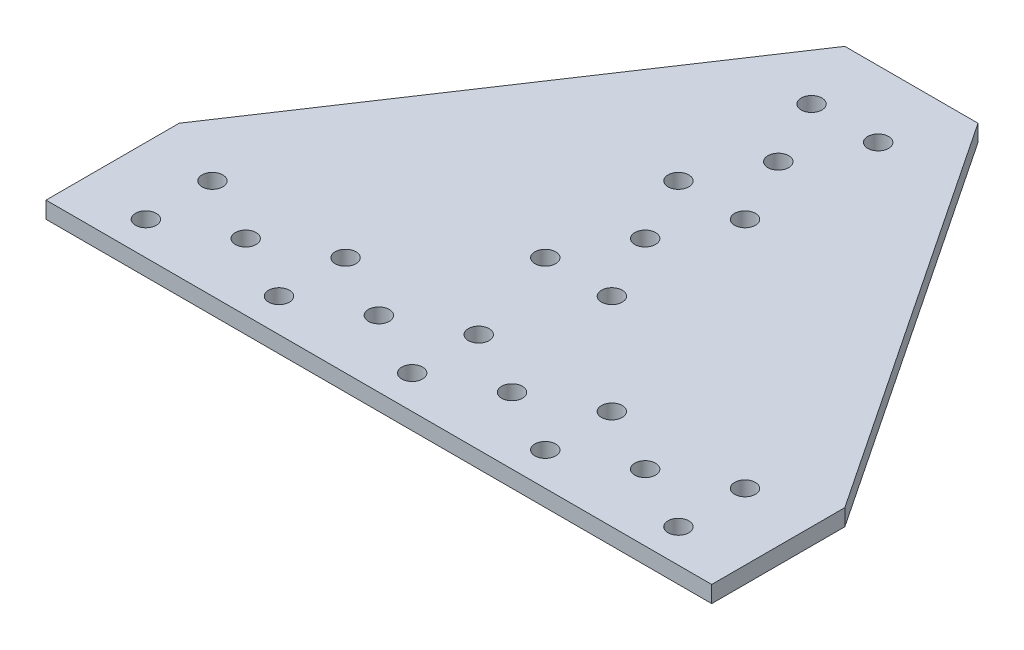
ISO-10303-21;
HEADER;
FILE_DESCRIPTION(('STEP AP214'),'2;1');
FILE_NAME('part.step','',(''),(''),'','','');
FILE_SCHEMA(('AUTOMOTIVE_DESIGN { 1 0 10303 214 1 1 1 1 }'));
ENDSEC;
DATA;
#1=APPLICATION_CONTEXT('core data for automotive mechanical design processes');
#2=APPLICATION_PROTOCOL_DEFINITION('international standard','automotive_design',2000,#1);
#3=PRODUCT_CONTEXT('',#1,'mechanical');
#4=PRODUCT('Part','Part','',(#3));
#5=PRODUCT_RELATED_PRODUCT_CATEGORY('part','',(#4));
#6=PRODUCT_DEFINITION_FORMATION('','',#4);
#7=PRODUCT_DEFINITION_CONTEXT('part definition',#1,'design');
#8=PRODUCT_DEFINITION('design','',#6,#7);
#9=PRODUCT_DEFINITION_SHAPE('','',#8);
#10=(LENGTH_UNIT() NAMED_UNIT(*) SI_UNIT(.MILLI.,.METRE.));
#11=(NAMED_UNIT(*) PLANE_ANGLE_UNIT() SI_UNIT($,.RADIAN.));
#12=(NAMED_UNIT(*) SI_UNIT($,.STERADIAN.) SOLID_ANGLE_UNIT());
#13=UNCERTAINTY_MEASURE_WITH_UNIT(LENGTH_MEASURE(1.E-05),#10,'distance_accuracy_value','');
#14=(GEOMETRIC_REPRESENTATION_CONTEXT(3) GLOBAL_UNCERTAINTY_ASSIGNED_CONTEXT((#13)) GLOBAL_UNIT_ASSIGNED_CONTEXT((#10,
#11,#12)) REPRESENTATION_CONTEXT('',''));
#15=CARTESIAN_POINT('',(0.,0.,0.));
#16=DIRECTION('',(0.,0.,1.));
#17=DIRECTION('',(1.,0.,0.));
#18=AXIS2_PLACEMENT_3D('',#15,#16,#17);
#19=CARTESIAN_POINT('',(0.,3.175,0.));
#20=DIRECTION('',(0.,1.,0.));
#21=DIRECTION('',(0.,0.,1.));
#22=AXIS2_PLACEMENT_3D('',#19,#20,#21);
#23=PLANE('',#22);
#24=CARTESIAN_POINT('',(-6.34999999999999,3.175,-63.5));
#25=DIRECTION('',(0.,1.,0.));
#26=DIRECTION('',(0.,0.,-1.));
#27=AXIS2_PLACEMENT_3D('',#24,#25,#26);
#28=CIRCLE('',#27,1.98437500000002);
#29=CARTESIAN_POINT('',(-6.34999999999999,3.175,-65.484375));
#30=VERTEX_POINT('',#29);
#31=EDGE_CURVE('E261',#30,#30,#28,.T.);
#32=ORIENTED_EDGE('',*,*,#31,.F.);
#33=EDGE_LOOP('',(#32));
#34=FACE_BOUND('',#33,.T.);
#35=CARTESIAN_POINT('',(-12.7000000000001,3.175,-12.7000000000001));
#36=DIRECTION('',(0.,1.,0.));
#37=DIRECTION('',(0.,0.,-1.));
#38=AXIS2_PLACEMENT_3D('',#35,#36,#37);
#39=CIRCLE('',#38,1.98437499999999);
#40=CARTESIAN_POINT('',(-12.7000000000001,3.175,-14.6843750000001));
#41=VERTEX_POINT('',#40);
#42=EDGE_CURVE('E273',#41,#41,#39,.T.);
#43=ORIENTED_EDGE('',*,*,#42,.F.);
#44=EDGE_LOOP('',(#43));
#45=FACE_BOUND('',#44,.T.);
#46=CARTESIAN_POINT('',(-25.4000000000001,3.175,-19.0500000000001));
#47=DIRECTION('',(0.,1.,0.));
#48=DIRECTION('',(0.,0.,-1.));
#49=AXIS2_PLACEMENT_3D('',#46,#47,#48);
#50=CIRCLE('',#49,1.984375);
#51=CARTESIAN_POINT('',(-25.4000000000001,3.175,-21.0343750000001));
#52=VERTEX_POINT('',#51);
#53=EDGE_CURVE('E285',#52,#52,#50,.T.);
#54=ORIENTED_EDGE('',*,*,#53,.F.);
#55=EDGE_LOOP('',(#54));
#56=FACE_BOUND('',#55,.T.);
#57=CARTESIAN_POINT('',(0.,3.175,-6.34999999999997));
#58=DIRECTION('',(0.,1.,0.));
#59=DIRECTION('',(0.,0.,-1.));
#60=AXIS2_PLACEMENT_3D('',#57,#58,#59);
#61=CIRCLE('',#60,1.98437500000004);
#62=CARTESIAN_POINT('',(0.,3.175,-8.334375));
#63=VERTEX_POINT('',#62);
#64=EDGE_CURVE('E297',#63,#63,#61,.T.);
#65=ORIENTED_EDGE('',*,*,#64,.F.);
#66=EDGE_LOOP('',(#65));
#67=FACE_BOUND('',#66,.T.);
#68=CARTESIAN_POINT('',(-50.8000000000001,3.175,-6.35000000000005));
#69=DIRECTION('',(0.,1.,0.));
#70=DIRECTION('',(0.,0.,-1.));
#71=AXIS2_PLACEMENT_3D('',#68,#69,#70);
#72=CIRCLE('',#71,1.98437499999995);
#73=CARTESIAN_POINT('',(-50.8000000000001,3.175,-8.334375));
#74=VERTEX_POINT('',#73);
#75=EDGE_CURVE('E309',#74,#74,#72,.T.);
#76=ORIENTED_EDGE('',*,*,#75,.F.);
#77=EDGE_LOOP('',(#76));
#78=FACE_BOUND('',#77,.T.);
#79=CARTESIAN_POINT('',(0.,3.175,-76.2));
#80=DIRECTION('',(0.,1.,0.));
#81=DIRECTION('',(0.,0.,-1.));
#82=AXIS2_PLACEMENT_3D('',#79,#80,#81);
#83=CIRCLE('',#82,1.98437500000004);
#84=CARTESIAN_POINT('',(0.,3.175,-78.1843750000001));
#85=VERTEX_POINT('',#84);
#86=EDGE_CURVE('E321',#85,#85,#83,.T.);
#87=ORIENTED_EDGE('',*,*,#86,.F.);
#88=EDGE_LOOP('',(#87));
#89=FACE_BOUND('',#88,.T.);
#90=CARTESIAN_POINT('',(50.8000000000001,3.175,-19.05));
#91=DIRECTION('',(0.,1.,0.));
#92=DIRECTION('',(0.,0.,1.));
#93=AXIS2_PLACEMENT_3D('',#90,#91,#92);
#94=CIRCLE('',#93,1.98437499999996);
#95=CARTESIAN_POINT('',(50.8000000000001,3.175,-17.065625));
#96=VERTEX_POINT('',#95);
#97=EDGE_CURVE('E333',#96,#96,#94,.T.);
#98=ORIENTED_EDGE('',*,*,#97,.F.);
#99=EDGE_LOOP('',(#98));
#100=FACE_BOUND('',#99,.T.);
#101=CARTESIAN_POINT('',(38.1000000000001,3.175,-12.7));
#102=DIRECTION('',(0.,1.,0.));
#103=DIRECTION('',(0.,0.,1.));
#104=AXIS2_PLACEMENT_3D('',#101,#102,#103);
#105=CIRCLE('',#104,1.984375);
#106=CARTESIAN_POINT('',(38.1000000000001,3.175,-10.715625));
#107=VERTEX_POINT('',#106);
#108=EDGE_CURVE('E345',#107,#107,#105,.T.);
#109=ORIENTED_EDGE('',*,*,#108,.F.);
#110=EDGE_LOOP('',(#109));
#111=FACE_BOUND('',#110,.T.);
#112=CARTESIAN_POINT('',(25.4000000000001,3.175,-6.34999999999997));
#113=DIRECTION('',(0.,1.,0.));
#114=DIRECTION('',(0.,0.,1.));
#115=AXIS2_PLACEMENT_3D('',#112,#113,#114);
#116=CIRCLE('',#115,1.98437499999998);
#117=CARTESIAN_POINT('',(25.4000000000001,3.175,-4.36562499999999));
#118=VERTEX_POINT('',#117);
#119=EDGE_CURVE('E357',#118,#118,#116,.T.);
#120=ORIENTED_EDGE('',*,*,#119,.F.);
#121=EDGE_LOOP('',(#120));
#122=FACE_BOUND('',#121,.T.);
#123=CARTESIAN_POINT('',(6.3500000000001,3.175,-38.1));
#124=DIRECTION('',(0.,1.,0.));
#125=DIRECTION('',(0.,0.,1.));
#126=AXIS2_PLACEMENT_3D('',#123,#124,#125);
#127=CIRCLE('',#126,1.98437499999996);
#128=CARTESIAN_POINT('',(6.3500000000001,3.175,-36.1156250000001));
#129=VERTEX_POINT('',#128);
#130=EDGE_CURVE('E369',#129,#129,#127,.T.);
#131=ORIENTED_EDGE('',*,*,#130,.F.);
#132=EDGE_LOOP('',(#131));
#133=FACE_BOUND('',#132,.T.);
#134=CARTESIAN_POINT('',(6.3500000000001,3.175,-88.9));
#135=DIRECTION('',(0.,1.,0.));
#136=DIRECTION('',(0.,0.,1.));
#137=AXIS2_PLACEMENT_3D('',#134,#135,#136);
#138=CIRCLE('',#137,1.98437499999998);
#139=CARTESIAN_POINT('',(6.3500000000001,3.175,-86.915625));
#140=VERTEX_POINT('',#139);
#141=EDGE_CURVE('E122',#140,#140,#138,.T.);
#142=ORIENTED_EDGE('',*,*,#141,.F.);
#143=EDGE_LOOP('',(#142));
#144=FACE_BOUND('',#143,.T.);
#145=DIRECTION('',(1.,0.,0.));
#146=VECTOR('',#145,1.);
#147=CARTESIAN_POINT('',(63.5000000000001,3.175,0.));
#148=LINE('',#147,#146);
#149=CARTESIAN_POINT('',(-63.5000000000001,3.175,-1.11022302462516E-13));
#150=VERTEX_POINT('',#149);
#151=CARTESIAN_POINT('',(63.5000000000001,3.175,0.));
#152=VERTEX_POINT('',#151);
#153=EDGE_CURVE('E129',#150,#152,#148,.T.);
#154=ORIENTED_EDGE('',*,*,#153,.T.);
#155=DIRECTION('',(0.,0.,-1.));
#156=VECTOR('',#155,1.);
#157=CARTESIAN_POINT('',(63.5000000000001,3.175,-25.4));
#158=LINE('',#157,#156);
#159=CARTESIAN_POINT('',(63.5000000000001,3.175,-25.4));
#160=VERTEX_POINT('',#159);
#161=EDGE_CURVE('E87',#152,#160,#158,.T.);
#162=ORIENTED_EDGE('',*,*,#161,.T.);
#163=DIRECTION('',(-0.554700196225229,0.,-0.832050294337844));
#164=VECTOR('',#163,1.);
#165=CARTESIAN_POINT('',(12.7000000000001,3.175,-101.6));
#166=LINE('',#165,#164);
#167=CARTESIAN_POINT('',(12.7000000000001,3.175,-101.6));
#168=VERTEX_POINT('',#167);
#169=EDGE_CURVE('E100',#160,#168,#166,.T.);
#170=ORIENTED_EDGE('',*,*,#169,.T.);
#171=DIRECTION('',(-1.,0.,0.));
#172=VECTOR('',#171,1.);
#173=CARTESIAN_POINT('',(-12.6999999999999,3.175,-101.6));
#174=LINE('',#173,#172);
#175=CARTESIAN_POINT('',(-12.6999999999999,3.175,-101.6));
#176=VERTEX_POINT('',#175);
#177=EDGE_CURVE('E94',#168,#176,#174,.T.);
#178=ORIENTED_EDGE('',*,*,#177,.T.);
#179=DIRECTION('',(-0.55470019622523,0.,0.832050294337843));
#180=VECTOR('',#179,1.);
#181=CARTESIAN_POINT('',(-12.6999999999999,3.175,-101.6));
#182=LINE('',#181,#180);
#183=CARTESIAN_POINT('',(-63.5,3.175,-25.4000000000001));
#184=VERTEX_POINT('',#183);
#185=EDGE_CURVE('E98',#176,#184,#182,.T.);
#186=ORIENTED_EDGE('',*,*,#185,.T.);
#187=DIRECTION('',(0.,0.,1.));
#188=VECTOR('',#187,1.);
#189=CARTESIAN_POINT('',(-63.5,3.175,-25.4000000000001));
#190=LINE('',#189,#188);
#191=EDGE_CURVE('E50',#184,#150,#190,.T.);
#192=ORIENTED_EDGE('',*,*,#191,.T.);
#193=EDGE_LOOP('',(#154,#162,#170,#178,#186,#192));
#194=FACE_BOUND('',#193,.T.);
#195=CARTESIAN_POINT('',(6.3500000000001,3.175,-63.5));
#196=DIRECTION('',(0.,1.,0.));
#197=DIRECTION('',(0.,0.,1.));
#198=AXIS2_PLACEMENT_3D('',#195,#196,#197);
#199=CIRCLE('',#198,1.98437500000002);
#200=CARTESIAN_POINT('',(6.3500000000001,3.175,-61.515625));
#201=VERTEX_POINT('',#200);
#202=EDGE_CURVE('E375',#201,#201,#199,.T.);
#203=ORIENTED_EDGE('',*,*,#202,.F.);
#204=EDGE_LOOP('',(#203));
#205=FACE_BOUND('',#204,.T.);
#206=CARTESIAN_POINT('',(12.7000000000001,3.175,-12.7));
#207=DIRECTION('',(0.,1.,0.));
#208=DIRECTION('',(0.,0.,1.));
#209=AXIS2_PLACEMENT_3D('',#206,#207,#208);
#210=CIRCLE('',#209,1.98437499999999);
#211=CARTESIAN_POINT('',(12.7000000000001,3.175,-10.7156250000001));
#212=VERTEX_POINT('',#211);
#213=EDGE_CURVE('E363',#212,#212,#210,.T.);
#214=ORIENTED_EDGE('',*,*,#213,.F.);
#215=EDGE_LOOP('',(#214));
#216=FACE_BOUND('',#215,.T.);
#217=CARTESIAN_POINT('',(25.4000000000001,3.175,-19.05));
#218=DIRECTION('',(0.,1.,0.));
#219=DIRECTION('',(0.,0.,1.));
#220=AXIS2_PLACEMENT_3D('',#217,#218,#219);
#221=CIRCLE('',#220,1.984375);
#222=CARTESIAN_POINT('',(25.4000000000001,3.175,-17.065625));
#223=VERTEX_POINT('',#222);
#224=EDGE_CURVE('E351',#223,#223,#221,.T.);
#225=ORIENTED_EDGE('',*,*,#224,.F.);
#226=EDGE_LOOP('',(#225));
#227=FACE_BOUND('',#226,.T.);
#228=CARTESIAN_POINT('',(50.8000000000001,3.175,-6.34999999999997));
#229=DIRECTION('',(0.,1.,0.));
#230=DIRECTION('',(0.,0.,1.));
#231=AXIS2_PLACEMENT_3D('',#228,#229,#230);
#232=CIRCLE('',#231,1.98437499999995);
#233=CARTESIAN_POINT('',(50.8000000000001,3.175,-4.36562500000002));
#234=VERTEX_POINT('',#233);
#235=EDGE_CURVE('E339',#234,#234,#232,.T.);
#236=ORIENTED_EDGE('',*,*,#235,.F.);
#237=EDGE_LOOP('',(#236));
#238=FACE_BOUND('',#237,.T.);
#239=CARTESIAN_POINT('',(-50.8000000000001,3.175,-19.0500000000001));
#240=DIRECTION('',(0.,1.,0.));
#241=DIRECTION('',(0.,0.,-1.));
#242=AXIS2_PLACEMENT_3D('',#239,#240,#241);
#243=CIRCLE('',#242,1.98437499999996);
#244=CARTESIAN_POINT('',(-50.8000000000001,3.175,-21.0343750000001));
#245=VERTEX_POINT('',#244);
#246=EDGE_CURVE('E327',#245,#245,#243,.T.);
#247=ORIENTED_EDGE('',*,*,#246,.F.);
#248=EDGE_LOOP('',(#247));
#249=FACE_BOUND('',#248,.T.);
#250=CARTESIAN_POINT('',(0.,3.175,-50.8000000000001));
#251=DIRECTION('',(0.,1.,0.));
#252=DIRECTION('',(0.,0.,-1.));
#253=AXIS2_PLACEMENT_3D('',#250,#251,#252);
#254=CIRCLE('',#253,1.98437500000004);
#255=CARTESIAN_POINT('',(0.,3.175,-52.7843750000001));
#256=VERTEX_POINT('',#255);
#257=EDGE_CURVE('E315',#256,#256,#254,.T.);
#258=ORIENTED_EDGE('',*,*,#257,.F.);
#259=EDGE_LOOP('',(#258));
#260=FACE_BOUND('',#259,.T.);
#261=CARTESIAN_POINT('',(0.,3.175,-19.05));
#262=DIRECTION('',(0.,1.,0.));
#263=DIRECTION('',(0.,0.,-1.));
#264=AXIS2_PLACEMENT_3D('',#261,#262,#263);
#265=CIRCLE('',#264,1.98437500000004);
#266=CARTESIAN_POINT('',(0.,3.175,-21.0343750000001));
#267=VERTEX_POINT('',#266);
#268=EDGE_CURVE('E303',#267,#267,#265,.T.);
#269=ORIENTED_EDGE('',*,*,#268,.F.);
#270=EDGE_LOOP('',(#269));
#271=FACE_BOUND('',#270,.T.);
#272=CARTESIAN_POINT('',(-38.1000000000001,3.175,-12.7000000000001));
#273=DIRECTION('',(0.,1.,0.));
#274=DIRECTION('',(0.,0.,-1.));
#275=AXIS2_PLACEMENT_3D('',#272,#273,#274);
#276=CIRCLE('',#275,1.984375);
#277=CARTESIAN_POINT('',(-38.1000000000001,3.175,-14.6843750000001));
#278=VERTEX_POINT('',#277);
#279=EDGE_CURVE('E291',#278,#278,#276,.T.);
#280=ORIENTED_EDGE('',*,*,#279,.F.);
#281=EDGE_LOOP('',(#280));
#282=FACE_BOUND('',#281,.T.);
#283=CARTESIAN_POINT('',(-25.4000000000001,3.175,-6.35000000000002));
#284=DIRECTION('',(0.,1.,0.));
#285=DIRECTION('',(0.,0.,-1.));
#286=AXIS2_PLACEMENT_3D('',#283,#284,#285);
#287=CIRCLE('',#286,1.98437499999998);
#288=CARTESIAN_POINT('',(-25.4000000000001,3.175,-8.334375));
#289=VERTEX_POINT('',#288);
#290=EDGE_CURVE('E279',#289,#289,#287,.T.);
#291=ORIENTED_EDGE('',*,*,#290,.F.);
#292=EDGE_LOOP('',(#291));
#293=FACE_BOUND('',#292,.T.);
#294=CARTESIAN_POINT('',(-6.35000000000003,3.175,-38.1));
#295=DIRECTION('',(0.,1.,0.));
#296=DIRECTION('',(0.,0.,-1.));
#297=AXIS2_PLACEMENT_3D('',#294,#295,#296);
#298=CIRCLE('',#297,1.98437499999996);
#299=CARTESIAN_POINT('',(-6.35000000000003,3.175,-40.084375));
#300=VERTEX_POINT('',#299);
#301=EDGE_CURVE('E267',#300,#300,#298,.T.);
#302=ORIENTED_EDGE('',*,*,#301,.F.);
#303=EDGE_LOOP('',(#302));
#304=FACE_BOUND('',#303,.T.);
#305=CARTESIAN_POINT('',(-6.34999999999995,3.175,-88.9));
#306=DIRECTION('',(0.,1.,0.));
#307=DIRECTION('',(0.,0.,-1.));
#308=AXIS2_PLACEMENT_3D('',#305,#306,#307);
#309=CIRCLE('',#308,1.98437499999998);
#310=CARTESIAN_POINT('',(-6.34999999999995,3.175,-90.884375));
#311=VERTEX_POINT('',#310);
#312=EDGE_CURVE('E252',#311,#311,#309,.T.);
#313=ORIENTED_EDGE('',*,*,#312,.F.);
#314=EDGE_LOOP('',(#313));
#315=FACE_BOUND('',#314,.T.);
#316=ADVANCED_FACE('F33',(#34,#45,#56,#67,#78,#89,#100,#111,#122,#133,#144,#194,#205,#216,#227,
#238,#249,#260,#271,#282,#293,#304,#315),#23,.T.);
#317=CARTESIAN_POINT('',(0.,0.,0.));
#318=DIRECTION('',(0.,1.,0.));
#319=DIRECTION('',(0.,0.,1.));
#320=AXIS2_PLACEMENT_3D('',#317,#318,#319);
#321=PLANE('',#320);
#322=DIRECTION('',(1.,0.,0.));
#323=VECTOR('',#322,1.);
#324=CARTESIAN_POINT('',(63.5000000000001,0.,0.));
#325=LINE('',#324,#323);
#326=CARTESIAN_POINT('',(-63.5000000000001,0.,-1.11022302462516E-13));
#327=VERTEX_POINT('',#326);
#328=CARTESIAN_POINT('',(63.5000000000001,0.,0.));
#329=VERTEX_POINT('',#328);
#330=EDGE_CURVE('E118',#327,#329,#325,.T.);
#331=ORIENTED_EDGE('',*,*,#330,.F.);
#332=DIRECTION('',(0.,0.,1.));
#333=VECTOR('',#332,1.);
#334=CARTESIAN_POINT('',(-63.5,0.,-25.4000000000001));
#335=LINE('',#334,#333);
#336=CARTESIAN_POINT('',(-63.5,0.,-25.4000000000001));
#337=VERTEX_POINT('',#336);
#338=EDGE_CURVE('E79',#337,#327,#335,.T.);
#339=ORIENTED_EDGE('',*,*,#338,.F.);
#340=DIRECTION('',(-0.55470019622523,0.,0.832050294337843));
#341=VECTOR('',#340,1.);
#342=CARTESIAN_POINT('',(-12.6999999999999,0.,-101.6));
#343=LINE('',#342,#341);
#344=CARTESIAN_POINT('',(-12.6999999999999,0.,-101.6));
#345=VERTEX_POINT('',#344);
#346=EDGE_CURVE('E73',#345,#337,#343,.T.);
#347=ORIENTED_EDGE('',*,*,#346,.F.);
#348=DIRECTION('',(-1.,0.,0.));
#349=VECTOR('',#348,1.);
#350=CARTESIAN_POINT('',(-12.6999999999999,0.,-101.6));
#351=LINE('',#350,#349);
#352=CARTESIAN_POINT('',(12.7000000000001,0.,-101.6));
#353=VERTEX_POINT('',#352);
#354=EDGE_CURVE('E108',#353,#345,#351,.T.);
#355=ORIENTED_EDGE('',*,*,#354,.F.);
#356=DIRECTION('',(-0.554700196225229,0.,-0.832050294337844));
#357=VECTOR('',#356,1.);
#358=CARTESIAN_POINT('',(12.7000000000001,0.,-101.6));
#359=LINE('',#358,#357);
#360=CARTESIAN_POINT('',(63.5000000000001,0.,-25.4));
#361=VERTEX_POINT('',#360);
#362=EDGE_CURVE('E124',#361,#353,#359,.T.);
#363=ORIENTED_EDGE('',*,*,#362,.F.);
#364=DIRECTION('',(0.,0.,-1.));
#365=VECTOR('',#364,1.);
#366=CARTESIAN_POINT('',(63.5000000000001,0.,-25.4));
#367=LINE('',#366,#365);
#368=EDGE_CURVE('E121',#329,#361,#367,.T.);
#369=ORIENTED_EDGE('',*,*,#368,.F.);
#370=EDGE_LOOP('',(#331,#339,#347,#355,#363,#369));
#371=FACE_BOUND('',#370,.T.);
#372=CARTESIAN_POINT('',(6.3500000000001,0.,-88.9));
#373=DIRECTION('',(0.,1.,0.));
#374=DIRECTION('',(0.,0.,1.));
#375=AXIS2_PLACEMENT_3D('',#372,#373,#374);
#376=CIRCLE('',#375,1.98437499999998);
#377=CARTESIAN_POINT('',(6.3500000000001,0.,-86.915625));
#378=VERTEX_POINT('',#377);
#379=EDGE_CURVE('E378',#378,#378,#376,.T.);
#380=ORIENTED_EDGE('',*,*,#379,.T.);
#381=EDGE_LOOP('',(#380));
#382=FACE_BOUND('',#381,.T.);
#383=CARTESIAN_POINT('',(6.3500000000001,0.,-63.5));
#384=DIRECTION('',(0.,1.,0.));
#385=DIRECTION('',(0.,0.,1.));
#386=AXIS2_PLACEMENT_3D('',#383,#384,#385);
#387=CIRCLE('',#386,1.98437500000002);
#388=CARTESIAN_POINT('',(6.3500000000001,0.,-61.515625));
#389=VERTEX_POINT('',#388);
#390=EDGE_CURVE('E372',#389,#389,#387,.T.);
#391=ORIENTED_EDGE('',*,*,#390,.T.);
#392=EDGE_LOOP('',(#391));
#393=FACE_BOUND('',#392,.T.);
#394=CARTESIAN_POINT('',(6.3500000000001,0.,-38.1));
#395=DIRECTION('',(0.,1.,0.));
#396=DIRECTION('',(0.,0.,1.));
#397=AXIS2_PLACEMENT_3D('',#394,#395,#396);
#398=CIRCLE('',#397,1.98437499999996);
#399=CARTESIAN_POINT('',(6.3500000000001,0.,-36.1156250000001));
#400=VERTEX_POINT('',#399);
#401=EDGE_CURVE('E366',#400,#400,#398,.T.);
#402=ORIENTED_EDGE('',*,*,#401,.T.);
#403=EDGE_LOOP('',(#402));
#404=FACE_BOUND('',#403,.T.);
#405=CARTESIAN_POINT('',(12.7000000000001,0.,-12.7));
#406=DIRECTION('',(0.,1.,0.));
#407=DIRECTION('',(0.,0.,1.));
#408=AXIS2_PLACEMENT_3D('',#405,#406,#407);
#409=CIRCLE('',#408,1.98437499999999);
#410=CARTESIAN_POINT('',(12.7000000000001,0.,-10.7156250000001));
#411=VERTEX_POINT('',#410);
#412=EDGE_CURVE('E360',#411,#411,#409,.T.);
#413=ORIENTED_EDGE('',*,*,#412,.T.);
#414=EDGE_LOOP('',(#413));
#415=FACE_BOUND('',#414,.T.);
#416=CARTESIAN_POINT('',(25.4000000000001,0.,-6.34999999999997));
#417=DIRECTION('',(0.,1.,0.));
#418=DIRECTION('',(0.,0.,1.));
#419=AXIS2_PLACEMENT_3D('',#416,#417,#418);
#420=CIRCLE('',#419,1.98437499999998);
#421=CARTESIAN_POINT('',(25.4000000000001,0.,-4.36562499999999));
#422=VERTEX_POINT('',#421);
#423=EDGE_CURVE('E354',#422,#422,#420,.T.);
#424=ORIENTED_EDGE('',*,*,#423,.T.);
#425=EDGE_LOOP('',(#424));
#426=FACE_BOUND('',#425,.T.);
#427=CARTESIAN_POINT('',(25.4000000000001,0.,-19.05));
#428=DIRECTION('',(0.,1.,0.));
#429=DIRECTION('',(0.,0.,1.));
#430=AXIS2_PLACEMENT_3D('',#427,#428,#429);
#431=CIRCLE('',#430,1.984375);
#432=CARTESIAN_POINT('',(25.4000000000001,0.,-17.065625));
#433=VERTEX_POINT('',#432);
#434=EDGE_CURVE('E348',#433,#433,#431,.T.);
#435=ORIENTED_EDGE('',*,*,#434,.T.);
#436=EDGE_LOOP('',(#435));
#437=FACE_BOUND('',#436,.T.);
#438=CARTESIAN_POINT('',(38.1000000000001,0.,-12.7));
#439=DIRECTION('',(0.,1.,0.));
#440=DIRECTION('',(0.,0.,1.));
#441=AXIS2_PLACEMENT_3D('',#438,#439,#440);
#442=CIRCLE('',#441,1.984375);
#443=CARTESIAN_POINT('',(38.1000000000001,0.,-10.715625));
#444=VERTEX_POINT('',#443);
#445=EDGE_CURVE('E342',#444,#444,#442,.T.);
#446=ORIENTED_EDGE('',*,*,#445,.T.);
#447=EDGE_LOOP('',(#446));
#448=FACE_BOUND('',#447,.T.);
#449=CARTESIAN_POINT('',(50.8000000000001,0.,-6.34999999999997));
#450=DIRECTION('',(0.,1.,0.));
#451=DIRECTION('',(0.,0.,1.));
#452=AXIS2_PLACEMENT_3D('',#449,#450,#451);
#453=CIRCLE('',#452,1.98437499999995);
#454=CARTESIAN_POINT('',(50.8000000000001,0.,-4.36562500000002));
#455=VERTEX_POINT('',#454);
#456=EDGE_CURVE('E336',#455,#455,#453,.T.);
#457=ORIENTED_EDGE('',*,*,#456,.T.);
#458=EDGE_LOOP('',(#457));
#459=FACE_BOUND('',#458,.T.);
#460=CARTESIAN_POINT('',(50.8000000000001,0.,-19.05));
#461=DIRECTION('',(0.,1.,0.));
#462=DIRECTION('',(0.,0.,1.));
#463=AXIS2_PLACEMENT_3D('',#460,#461,#462);
#464=CIRCLE('',#463,1.98437499999996);
#465=CARTESIAN_POINT('',(50.8000000000001,0.,-17.065625));
#466=VERTEX_POINT('',#465);
#467=EDGE_CURVE('E330',#466,#466,#464,.T.);
#468=ORIENTED_EDGE('',*,*,#467,.T.);
#469=EDGE_LOOP('',(#468));
#470=FACE_BOUND('',#469,.T.);
#471=CARTESIAN_POINT('',(-50.8000000000001,0.,-19.0500000000001));
#472=DIRECTION('',(0.,1.,0.));
#473=DIRECTION('',(0.,0.,-1.));
#474=AXIS2_PLACEMENT_3D('',#471,#472,#473);
#475=CIRCLE('',#474,1.98437499999996);
#476=CARTESIAN_POINT('',(-50.8000000000001,0.,-21.0343750000001));
#477=VERTEX_POINT('',#476);
#478=EDGE_CURVE('E324',#477,#477,#475,.T.);
#479=ORIENTED_EDGE('',*,*,#478,.T.);
#480=EDGE_LOOP('',(#479));
#481=FACE_BOUND('',#480,.T.);
#482=CARTESIAN_POINT('',(0.,0.,-76.2));
#483=DIRECTION('',(0.,1.,0.));
#484=DIRECTION('',(0.,0.,-1.));
#485=AXIS2_PLACEMENT_3D('',#482,#483,#484);
#486=CIRCLE('',#485,1.98437500000004);
#487=CARTESIAN_POINT('',(0.,0.,-78.1843750000001));
#488=VERTEX_POINT('',#487);
#489=EDGE_CURVE('E318',#488,#488,#486,.T.);
#490=ORIENTED_EDGE('',*,*,#489,.T.);
#491=EDGE_LOOP('',(#490));
#492=FACE_BOUND('',#491,.T.);
#493=CARTESIAN_POINT('',(0.,0.,-50.8000000000001));
#494=DIRECTION('',(0.,1.,0.));
#495=DIRECTION('',(0.,0.,-1.));
#496=AXIS2_PLACEMENT_3D('',#493,#494,#495);
#497=CIRCLE('',#496,1.98437500000004);
#498=CARTESIAN_POINT('',(0.,0.,-52.7843750000001));
#499=VERTEX_POINT('',#498);
#500=EDGE_CURVE('E312',#499,#499,#497,.T.);
#501=ORIENTED_EDGE('',*,*,#500,.T.);
#502=EDGE_LOOP('',(#501));
#503=FACE_BOUND('',#502,.T.);
#504=CARTESIAN_POINT('',(-50.8000000000001,0.,-6.35000000000005));
#505=DIRECTION('',(0.,1.,0.));
#506=DIRECTION('',(0.,0.,-1.));
#507=AXIS2_PLACEMENT_3D('',#504,#505,#506);
#508=CIRCLE('',#507,1.98437499999995);
#509=CARTESIAN_POINT('',(-50.8000000000001,0.,-8.334375));
#510=VERTEX_POINT('',#509);
#511=EDGE_CURVE('E306',#510,#510,#508,.T.);
#512=ORIENTED_EDGE('',*,*,#511,.T.);
#513=EDGE_LOOP('',(#512));
#514=FACE_BOUND('',#513,.T.);
#515=CARTESIAN_POINT('',(0.,0.,-19.05));
#516=DIRECTION('',(0.,1.,0.));
#517=DIRECTION('',(0.,0.,-1.));
#518=AXIS2_PLACEMENT_3D('',#515,#516,#517);
#519=CIRCLE('',#518,1.98437500000004);
#520=CARTESIAN_POINT('',(0.,0.,-21.0343750000001));
#521=VERTEX_POINT('',#520);
#522=EDGE_CURVE('E300',#521,#521,#519,.T.);
#523=ORIENTED_EDGE('',*,*,#522,.T.);
#524=EDGE_LOOP('',(#523));
#525=FACE_BOUND('',#524,.T.);
#526=CARTESIAN_POINT('',(0.,0.,-6.34999999999997));
#527=DIRECTION('',(0.,1.,0.));
#528=DIRECTION('',(0.,0.,-1.));
#529=AXIS2_PLACEMENT_3D('',#526,#527,#528);
#530=CIRCLE('',#529,1.98437500000004);
#531=CARTESIAN_POINT('',(0.,0.,-8.334375));
#532=VERTEX_POINT('',#531);
#533=EDGE_CURVE('E294',#532,#532,#530,.T.);
#534=ORIENTED_EDGE('',*,*,#533,.T.);
#535=EDGE_LOOP('',(#534));
#536=FACE_BOUND('',#535,.T.);
#537=CARTESIAN_POINT('',(-38.1000000000001,0.,-12.7000000000001));
#538=DIRECTION('',(0.,1.,0.));
#539=DIRECTION('',(0.,0.,-1.));
#540=AXIS2_PLACEMENT_3D('',#537,#538,#539);
#541=CIRCLE('',#540,1.984375);
#542=CARTESIAN_POINT('',(-38.1000000000001,0.,-14.6843750000001));
#543=VERTEX_POINT('',#542);
#544=EDGE_CURVE('E288',#543,#543,#541,.T.);
#545=ORIENTED_EDGE('',*,*,#544,.T.);
#546=EDGE_LOOP('',(#545));
#547=FACE_BOUND('',#546,.T.);
#548=CARTESIAN_POINT('',(-25.4000000000001,0.,-19.0500000000001));
#549=DIRECTION('',(0.,1.,0.));
#550=DIRECTION('',(0.,0.,-1.));
#551=AXIS2_PLACEMENT_3D('',#548,#549,#550);
#552=CIRCLE('',#551,1.984375);
#553=CARTESIAN_POINT('',(-25.4000000000001,0.,-21.0343750000001));
#554=VERTEX_POINT('',#553);
#555=EDGE_CURVE('E282',#554,#554,#552,.T.);
#556=ORIENTED_EDGE('',*,*,#555,.T.);
#557=EDGE_LOOP('',(#556));
#558=FACE_BOUND('',#557,.T.);
#559=CARTESIAN_POINT('',(-25.4000000000001,0.,-6.35000000000002));
#560=DIRECTION('',(0.,1.,0.));
#561=DIRECTION('',(0.,0.,-1.));
#562=AXIS2_PLACEMENT_3D('',#559,#560,#561);
#563=CIRCLE('',#562,1.98437499999998);
#564=CARTESIAN_POINT('',(-25.4000000000001,0.,-8.334375));
#565=VERTEX_POINT('',#564);
#566=EDGE_CURVE('E276',#565,#565,#563,.T.);
#567=ORIENTED_EDGE('',*,*,#566,.T.);
#568=EDGE_LOOP('',(#567));
#569=FACE_BOUND('',#568,.T.);
#570=CARTESIAN_POINT('',(-12.7000000000001,0.,-12.7000000000001));
#571=DIRECTION('',(0.,1.,0.));
#572=DIRECTION('',(0.,0.,-1.));
#573=AXIS2_PLACEMENT_3D('',#570,#571,#572);
#574=CIRCLE('',#573,1.98437499999999);
#575=CARTESIAN_POINT('',(-12.7000000000001,0.,-14.6843750000001));
#576=VERTEX_POINT('',#575);
#577=EDGE_CURVE('E270',#576,#576,#574,.T.);
#578=ORIENTED_EDGE('',*,*,#577,.T.);
#579=EDGE_LOOP('',(#578));
#580=FACE_BOUND('',#579,.T.);
#581=CARTESIAN_POINT('',(-6.35000000000003,0.,-38.1));
#582=DIRECTION('',(0.,1.,0.));
#583=DIRECTION('',(0.,0.,-1.));
#584=AXIS2_PLACEMENT_3D('',#581,#582,#583);
#585=CIRCLE('',#584,1.98437499999996);
#586=CARTESIAN_POINT('',(-6.35000000000003,0.,-40.084375));
#587=VERTEX_POINT('',#586);
#588=EDGE_CURVE('E264',#587,#587,#585,.T.);
#589=ORIENTED_EDGE('',*,*,#588,.T.);
#590=EDGE_LOOP('',(#589));
#591=FACE_BOUND('',#590,.T.);
#592=CARTESIAN_POINT('',(-6.34999999999999,0.,-63.5));
#593=DIRECTION('',(0.,1.,0.));
#594=DIRECTION('',(0.,0.,-1.));
#595=AXIS2_PLACEMENT_3D('',#592,#593,#594);
#596=CIRCLE('',#595,1.98437500000002);
#597=CARTESIAN_POINT('',(-6.34999999999999,0.,-65.484375));
#598=VERTEX_POINT('',#597);
#599=EDGE_CURVE('E258',#598,#598,#596,.T.);
#600=ORIENTED_EDGE('',*,*,#599,.T.);
#601=EDGE_LOOP('',(#600));
#602=FACE_BOUND('',#601,.T.);
#603=CARTESIAN_POINT('',(-6.34999999999995,0.,-88.9));
#604=DIRECTION('',(0.,1.,0.));
#605=DIRECTION('',(0.,0.,-1.));
#606=AXIS2_PLACEMENT_3D('',#603,#604,#605);
#607=CIRCLE('',#606,1.98437499999998);
#608=CARTESIAN_POINT('',(-6.34999999999995,0.,-90.884375));
#609=VERTEX_POINT('',#608);
#610=EDGE_CURVE('E255',#609,#609,#607,.T.);
#611=ORIENTED_EDGE('',*,*,#610,.T.);
#612=EDGE_LOOP('',(#611));
#613=FACE_BOUND('',#612,.T.);
#614=ADVANCED_FACE('F138',(#371,#382,#393,#404,#415,#426,#437,#448,#459,#470,#481,#492,#503,
#514,#525,#536,#547,#558,#569,#580,#591,#602,#613),#321,.F.);
#615=CARTESIAN_POINT('',(63.5000000000001,3.175,0.));
#616=DIRECTION('',(0.,0.,-1.));
#617=DIRECTION('',(-1.,0.,0.));
#618=AXIS2_PLACEMENT_3D('',#615,#616,#617);
#619=PLANE('',#618);
#620=ORIENTED_EDGE('',*,*,#330,.T.);
#621=DIRECTION('',(0.,-1.,0.));
#622=VECTOR('',#621,1.);
#623=CARTESIAN_POINT('',(63.5000000000001,3.175,0.));
#624=LINE('',#623,#622);
#625=EDGE_CURVE('E11',#152,#329,#624,.T.);
#626=ORIENTED_EDGE('',*,*,#625,.F.);
#627=ORIENTED_EDGE('',*,*,#153,.F.);
#628=DIRECTION('',(0.,-1.,0.));
#629=VECTOR('',#628,1.);
#630=CARTESIAN_POINT('',(-63.5000000000001,3.175,-1.11022302462516E-13));
#631=LINE('',#630,#629);
#632=EDGE_CURVE('E114',#150,#327,#631,.T.);
#633=ORIENTED_EDGE('',*,*,#632,.T.);
#634=EDGE_LOOP('',(#620,#626,#627,#633));
#635=FACE_BOUND('',#634,.T.);
#636=ADVANCED_FACE('F35',(#635),#619,.F.);
#637=CARTESIAN_POINT('',(63.5000000000001,3.175,-25.4));
#638=DIRECTION('',(-1.,0.,0.));
#639=DIRECTION('',(0.,0.,1.));
#640=AXIS2_PLACEMENT_3D('',#637,#638,#639);
#641=PLANE('',#640);
#642=ORIENTED_EDGE('',*,*,#368,.T.);
#643=DIRECTION('',(0.,-1.,0.));
#644=VECTOR('',#643,1.);
#645=CARTESIAN_POINT('',(63.5000000000001,3.175,-25.4));
#646=LINE('',#645,#644);
#647=EDGE_CURVE('E42',#160,#361,#646,.T.);
#648=ORIENTED_EDGE('',*,*,#647,.F.);
#649=ORIENTED_EDGE('',*,*,#161,.F.);
#650=ORIENTED_EDGE('',*,*,#625,.T.);
#651=EDGE_LOOP('',(#642,#648,#649,#650));
#652=FACE_BOUND('',#651,.T.);
#653=ADVANCED_FACE('F598',(#652),#641,.F.);
#654=CARTESIAN_POINT('',(12.7000000000001,3.175,-101.6));
#655=DIRECTION('',(-0.832050294337844,0.,0.554700196225229));
#656=DIRECTION('',(0.554700196225229,0.,0.832050294337844));
#657=AXIS2_PLACEMENT_3D('',#654,#655,#656);
#658=PLANE('',#657);
#659=ORIENTED_EDGE('',*,*,#362,.T.);
#660=DIRECTION('',(0.,-1.,0.));
#661=VECTOR('',#660,1.);
#662=CARTESIAN_POINT('',(12.7000000000001,3.175,-101.6));
#663=LINE('',#662,#661);
#664=EDGE_CURVE('E109',#168,#353,#663,.T.);
#665=ORIENTED_EDGE('',*,*,#664,.F.);
#666=ORIENTED_EDGE('',*,*,#169,.F.);
#667=ORIENTED_EDGE('',*,*,#647,.T.);
#668=EDGE_LOOP('',(#659,#665,#666,#667));
#669=FACE_BOUND('',#668,.T.);
#670=ADVANCED_FACE('F135',(#669),#658,.F.);
#671=CARTESIAN_POINT('',(-12.6999999999999,3.175,-101.6));
#672=DIRECTION('',(0.,0.,1.));
#673=DIRECTION('',(1.,0.,0.));
#674=AXIS2_PLACEMENT_3D('',#671,#672,#673);
#675=PLANE('',#674);
#676=ORIENTED_EDGE('',*,*,#354,.T.);
#677=DIRECTION('',(0.,-1.,0.));
#678=VECTOR('',#677,1.);
#679=CARTESIAN_POINT('',(-12.6999999999999,3.175,-101.6));
#680=LINE('',#679,#678);
#681=EDGE_CURVE('E105',#176,#345,#680,.T.);
#682=ORIENTED_EDGE('',*,*,#681,.F.);
#683=ORIENTED_EDGE('',*,*,#177,.F.);
#684=ORIENTED_EDGE('',*,*,#664,.T.);
#685=EDGE_LOOP('',(#676,#682,#683,#684));
#686=FACE_BOUND('',#685,.T.);
#687=ADVANCED_FACE('F106',(#686),#675,.F.);
#688=CARTESIAN_POINT('',(-12.6999999999999,3.175,-101.6));
#689=DIRECTION('',(0.832050294337843,0.,0.55470019622523));
#690=DIRECTION('',(0.55470019622523,0.,-0.832050294337843));
#691=AXIS2_PLACEMENT_3D('',#688,#689,#690);
#692=PLANE('',#691);
#693=ORIENTED_EDGE('',*,*,#346,.T.);
#694=DIRECTION('',(0.,-1.,0.));
#695=VECTOR('',#694,1.);
#696=CARTESIAN_POINT('',(-63.5,3.175,-25.4000000000001));
#697=LINE('',#696,#695);
#698=EDGE_CURVE('E110',#184,#337,#697,.T.);
#699=ORIENTED_EDGE('',*,*,#698,.F.);
#700=ORIENTED_EDGE('',*,*,#185,.F.);
#701=ORIENTED_EDGE('',*,*,#681,.T.);
#702=EDGE_LOOP('',(#693,#699,#700,#701));
#703=FACE_BOUND('',#702,.T.);
#704=ADVANCED_FACE('F112',(#703),#692,.F.);
#705=CARTESIAN_POINT('',(-63.5,3.175,-25.4000000000001));
#706=DIRECTION('',(1.,0.,0.));
#707=DIRECTION('',(0.,0.,-1.));
#708=AXIS2_PLACEMENT_3D('',#705,#706,#707);
#709=PLANE('',#708);
#710=ORIENTED_EDGE('',*,*,#338,.T.);
#711=ORIENTED_EDGE('',*,*,#632,.F.);
#712=ORIENTED_EDGE('',*,*,#191,.F.);
#713=ORIENTED_EDGE('',*,*,#698,.T.);
#714=EDGE_LOOP('',(#710,#711,#712,#713));
#715=FACE_BOUND('',#714,.T.);
#716=ADVANCED_FACE('F143',(#715),#709,.F.);
#717=CARTESIAN_POINT('',(6.3500000000001,3.175,-88.9));
#718=DIRECTION('',(0.,-1.,0.));
#719=DIRECTION('',(0.,0.,-1.));
#720=AXIS2_PLACEMENT_3D('',#717,#718,#719);
#721=CYLINDRICAL_SURFACE('',#720,1.98437499999998);
#722=ORIENTED_EDGE('',*,*,#141,.T.);
#723=EDGE_LOOP('',(#722));
#724=FACE_BOUND('',#723,.T.);
#725=ORIENTED_EDGE('',*,*,#379,.F.);
#726=EDGE_LOOP('',(#725));
#727=FACE_BOUND('',#726,.T.);
#728=ADVANCED_FACE('F145',(#724,#727),#721,.F.);
#729=CARTESIAN_POINT('',(6.3500000000001,3.175,-63.5));
#730=DIRECTION('',(0.,-1.,0.));
#731=DIRECTION('',(0.,0.,-1.));
#732=AXIS2_PLACEMENT_3D('',#729,#730,#731);
#733=CYLINDRICAL_SURFACE('',#732,1.98437500000002);
#734=ORIENTED_EDGE('',*,*,#202,.T.);
#735=EDGE_LOOP('',(#734));
#736=FACE_BOUND('',#735,.T.);
#737=ORIENTED_EDGE('',*,*,#390,.F.);
#738=EDGE_LOOP('',(#737));
#739=FACE_BOUND('',#738,.T.);
#740=ADVANCED_FACE('F151',(#736,#739),#733,.F.);
#741=CARTESIAN_POINT('',(6.3500000000001,3.175,-38.1));
#742=DIRECTION('',(0.,-1.,0.));
#743=DIRECTION('',(0.,0.,-1.));
#744=AXIS2_PLACEMENT_3D('',#741,#742,#743);
#745=CYLINDRICAL_SURFACE('',#744,1.98437499999996);
#746=ORIENTED_EDGE('',*,*,#130,.T.);
#747=EDGE_LOOP('',(#746));
#748=FACE_BOUND('',#747,.T.);
#749=ORIENTED_EDGE('',*,*,#401,.F.);
#750=EDGE_LOOP('',(#749));
#751=FACE_BOUND('',#750,.T.);
#752=ADVANCED_FACE('F167',(#748,#751),#745,.F.);
#753=CARTESIAN_POINT('',(12.7000000000001,3.175,-12.7));
#754=DIRECTION('',(0.,-1.,0.));
#755=DIRECTION('',(0.,0.,-1.));
#756=AXIS2_PLACEMENT_3D('',#753,#754,#755);
#757=CYLINDRICAL_SURFACE('',#756,1.98437499999999);
#758=ORIENTED_EDGE('',*,*,#213,.T.);
#759=EDGE_LOOP('',(#758));
#760=FACE_BOUND('',#759,.T.);
#761=ORIENTED_EDGE('',*,*,#412,.F.);
#762=EDGE_LOOP('',(#761));
#763=FACE_BOUND('',#762,.T.);
#764=ADVANCED_FACE('F171',(#760,#763),#757,.F.);
#765=CARTESIAN_POINT('',(25.4000000000001,3.175,-6.34999999999997));
#766=DIRECTION('',(0.,-1.,0.));
#767=DIRECTION('',(0.,0.,-1.));
#768=AXIS2_PLACEMENT_3D('',#765,#766,#767);
#769=CYLINDRICAL_SURFACE('',#768,1.98437499999998);
#770=ORIENTED_EDGE('',*,*,#119,.T.);
#771=EDGE_LOOP('',(#770));
#772=FACE_BOUND('',#771,.T.);
#773=ORIENTED_EDGE('',*,*,#423,.F.);
#774=EDGE_LOOP('',(#773));
#775=FACE_BOUND('',#774,.T.);
#776=ADVANCED_FACE('F175',(#772,#775),#769,.F.);
#777=CARTESIAN_POINT('',(25.4000000000001,3.175,-19.05));
#778=DIRECTION('',(0.,-1.,0.));
#779=DIRECTION('',(0.,0.,-1.));
#780=AXIS2_PLACEMENT_3D('',#777,#778,#779);
#781=CYLINDRICAL_SURFACE('',#780,1.984375);
#782=ORIENTED_EDGE('',*,*,#224,.T.);
#783=EDGE_LOOP('',(#782));
#784=FACE_BOUND('',#783,.T.);
#785=ORIENTED_EDGE('',*,*,#434,.F.);
#786=EDGE_LOOP('',(#785));
#787=FACE_BOUND('',#786,.T.);
#788=ADVANCED_FACE('F179',(#784,#787),#781,.F.);
#789=CARTESIAN_POINT('',(38.1000000000001,3.175,-12.7));
#790=DIRECTION('',(0.,-1.,0.));
#791=DIRECTION('',(0.,0.,-1.));
#792=AXIS2_PLACEMENT_3D('',#789,#790,#791);
#793=CYLINDRICAL_SURFACE('',#792,1.984375);
#794=ORIENTED_EDGE('',*,*,#108,.T.);
#795=EDGE_LOOP('',(#794));
#796=FACE_BOUND('',#795,.T.);
#797=ORIENTED_EDGE('',*,*,#445,.F.);
#798=EDGE_LOOP('',(#797));
#799=FACE_BOUND('',#798,.T.);
#800=ADVANCED_FACE('F183',(#796,#799),#793,.F.);
#801=CARTESIAN_POINT('',(50.8000000000001,3.175,-6.34999999999997));
#802=DIRECTION('',(0.,-1.,0.));
#803=DIRECTION('',(0.,0.,-1.));
#804=AXIS2_PLACEMENT_3D('',#801,#802,#803);
#805=CYLINDRICAL_SURFACE('',#804,1.98437499999995);
#806=ORIENTED_EDGE('',*,*,#235,.T.);
#807=EDGE_LOOP('',(#806));
#808=FACE_BOUND('',#807,.T.);
#809=ORIENTED_EDGE('',*,*,#456,.F.);
#810=EDGE_LOOP('',(#809));
#811=FACE_BOUND('',#810,.T.);
#812=ADVANCED_FACE('F187',(#808,#811),#805,.F.);
#813=CARTESIAN_POINT('',(50.8000000000001,3.175,-19.05));
#814=DIRECTION('',(0.,-1.,0.));
#815=DIRECTION('',(0.,0.,-1.));
#816=AXIS2_PLACEMENT_3D('',#813,#814,#815);
#817=CYLINDRICAL_SURFACE('',#816,1.98437499999996);
#818=ORIENTED_EDGE('',*,*,#97,.T.);
#819=EDGE_LOOP('',(#818));
#820=FACE_BOUND('',#819,.T.);
#821=ORIENTED_EDGE('',*,*,#467,.F.);
#822=EDGE_LOOP('',(#821));
#823=FACE_BOUND('',#822,.T.);
#824=ADVANCED_FACE('F191',(#820,#823),#817,.F.);
#825=CARTESIAN_POINT('',(-50.8000000000001,3.175,-19.0500000000001));
#826=DIRECTION('',(0.,-1.,0.));
#827=DIRECTION('',(0.,0.,-1.));
#828=AXIS2_PLACEMENT_3D('',#825,#826,#827);
#829=CYLINDRICAL_SURFACE('',#828,1.98437499999996);
#830=ORIENTED_EDGE('',*,*,#246,.T.);
#831=EDGE_LOOP('',(#830));
#832=FACE_BOUND('',#831,.T.);
#833=ORIENTED_EDGE('',*,*,#478,.F.);
#834=EDGE_LOOP('',(#833));
#835=FACE_BOUND('',#834,.T.);
#836=ADVANCED_FACE('F195',(#832,#835),#829,.F.);
#837=CARTESIAN_POINT('',(0.,3.175,-76.2));
#838=DIRECTION('',(0.,-1.,0.));
#839=DIRECTION('',(0.,0.,-1.));
#840=AXIS2_PLACEMENT_3D('',#837,#838,#839);
#841=CYLINDRICAL_SURFACE('',#840,1.98437500000004);
#842=ORIENTED_EDGE('',*,*,#86,.T.);
#843=EDGE_LOOP('',(#842));
#844=FACE_BOUND('',#843,.T.);
#845=ORIENTED_EDGE('',*,*,#489,.F.);
#846=EDGE_LOOP('',(#845));
#847=FACE_BOUND('',#846,.T.);
#848=ADVANCED_FACE('F199',(#844,#847),#841,.F.);
#849=CARTESIAN_POINT('',(0.,3.175,-50.8000000000001));
#850=DIRECTION('',(0.,-1.,0.));
#851=DIRECTION('',(0.,0.,-1.));
#852=AXIS2_PLACEMENT_3D('',#849,#850,#851);
#853=CYLINDRICAL_SURFACE('',#852,1.98437500000004);
#854=ORIENTED_EDGE('',*,*,#257,.T.);
#855=EDGE_LOOP('',(#854));
#856=FACE_BOUND('',#855,.T.);
#857=ORIENTED_EDGE('',*,*,#500,.F.);
#858=EDGE_LOOP('',(#857));
#859=FACE_BOUND('',#858,.T.);
#860=ADVANCED_FACE('F203',(#856,#859),#853,.F.);
#861=CARTESIAN_POINT('',(-50.8000000000001,3.175,-6.35000000000005));
#862=DIRECTION('',(0.,-1.,0.));
#863=DIRECTION('',(0.,0.,-1.));
#864=AXIS2_PLACEMENT_3D('',#861,#862,#863);
#865=CYLINDRICAL_SURFACE('',#864,1.98437499999995);
#866=ORIENTED_EDGE('',*,*,#75,.T.);
#867=EDGE_LOOP('',(#866));
#868=FACE_BOUND('',#867,.T.);
#869=ORIENTED_EDGE('',*,*,#511,.F.);
#870=EDGE_LOOP('',(#869));
#871=FACE_BOUND('',#870,.T.);
#872=ADVANCED_FACE('F207',(#868,#871),#865,.F.);
#873=CARTESIAN_POINT('',(0.,3.175,-19.05));
#874=DIRECTION('',(0.,-1.,0.));
#875=DIRECTION('',(0.,0.,-1.));
#876=AXIS2_PLACEMENT_3D('',#873,#874,#875);
#877=CYLINDRICAL_SURFACE('',#876,1.98437500000004);
#878=ORIENTED_EDGE('',*,*,#268,.T.);
#879=EDGE_LOOP('',(#878));
#880=FACE_BOUND('',#879,.T.);
#881=ORIENTED_EDGE('',*,*,#522,.F.);
#882=EDGE_LOOP('',(#881));
#883=FACE_BOUND('',#882,.T.);
#884=ADVANCED_FACE('F211',(#880,#883),#877,.F.);
#885=CARTESIAN_POINT('',(0.,3.175,-6.34999999999997));
#886=DIRECTION('',(0.,-1.,0.));
#887=DIRECTION('',(0.,0.,-1.));
#888=AXIS2_PLACEMENT_3D('',#885,#886,#887);
#889=CYLINDRICAL_SURFACE('',#888,1.98437500000004);
#890=ORIENTED_EDGE('',*,*,#64,.T.);
#891=EDGE_LOOP('',(#890));
#892=FACE_BOUND('',#891,.T.);
#893=ORIENTED_EDGE('',*,*,#533,.F.);
#894=EDGE_LOOP('',(#893));
#895=FACE_BOUND('',#894,.T.);
#896=ADVANCED_FACE('F215',(#892,#895),#889,.F.);
#897=CARTESIAN_POINT('',(-38.1000000000001,3.175,-12.7000000000001));
#898=DIRECTION('',(0.,-1.,0.));
#899=DIRECTION('',(0.,0.,-1.));
#900=AXIS2_PLACEMENT_3D('',#897,#898,#899);
#901=CYLINDRICAL_SURFACE('',#900,1.984375);
#902=ORIENTED_EDGE('',*,*,#279,.T.);
#903=EDGE_LOOP('',(#902));
#904=FACE_BOUND('',#903,.T.);
#905=ORIENTED_EDGE('',*,*,#544,.F.);
#906=EDGE_LOOP('',(#905));
#907=FACE_BOUND('',#906,.T.);
#908=ADVANCED_FACE('F219',(#904,#907),#901,.F.);
#909=CARTESIAN_POINT('',(-25.4000000000001,3.175,-19.0500000000001));
#910=DIRECTION('',(0.,-1.,0.));
#911=DIRECTION('',(0.,0.,-1.));
#912=AXIS2_PLACEMENT_3D('',#909,#910,#911);
#913=CYLINDRICAL_SURFACE('',#912,1.984375);
#914=ORIENTED_EDGE('',*,*,#53,.T.);
#915=EDGE_LOOP('',(#914));
#916=FACE_BOUND('',#915,.T.);
#917=ORIENTED_EDGE('',*,*,#555,.F.);
#918=EDGE_LOOP('',(#917));
#919=FACE_BOUND('',#918,.T.);
#920=ADVANCED_FACE('F223',(#916,#919),#913,.F.);
#921=CARTESIAN_POINT('',(-25.4000000000001,3.175,-6.35000000000002));
#922=DIRECTION('',(0.,-1.,0.));
#923=DIRECTION('',(0.,0.,-1.));
#924=AXIS2_PLACEMENT_3D('',#921,#922,#923);
#925=CYLINDRICAL_SURFACE('',#924,1.98437499999998);
#926=ORIENTED_EDGE('',*,*,#290,.T.);
#927=EDGE_LOOP('',(#926));
#928=FACE_BOUND('',#927,.T.);
#929=ORIENTED_EDGE('',*,*,#566,.F.);
#930=EDGE_LOOP('',(#929));
#931=FACE_BOUND('',#930,.T.);
#932=ADVANCED_FACE('F227',(#928,#931),#925,.F.);
#933=CARTESIAN_POINT('',(-12.7000000000001,3.175,-12.7000000000001));
#934=DIRECTION('',(0.,-1.,0.));
#935=DIRECTION('',(0.,0.,-1.));
#936=AXIS2_PLACEMENT_3D('',#933,#934,#935);
#937=CYLINDRICAL_SURFACE('',#936,1.98437499999999);
#938=ORIENTED_EDGE('',*,*,#42,.T.);
#939=EDGE_LOOP('',(#938));
#940=FACE_BOUND('',#939,.T.);
#941=ORIENTED_EDGE('',*,*,#577,.F.);
#942=EDGE_LOOP('',(#941));
#943=FACE_BOUND('',#942,.T.);
#944=ADVANCED_FACE('F231',(#940,#943),#937,.F.);
#945=CARTESIAN_POINT('',(-6.35000000000003,3.175,-38.1));
#946=DIRECTION('',(0.,-1.,0.));
#947=DIRECTION('',(0.,0.,-1.));
#948=AXIS2_PLACEMENT_3D('',#945,#946,#947);
#949=CYLINDRICAL_SURFACE('',#948,1.98437499999996);
#950=ORIENTED_EDGE('',*,*,#301,.T.);
#951=EDGE_LOOP('',(#950));
#952=FACE_BOUND('',#951,.T.);
#953=ORIENTED_EDGE('',*,*,#588,.F.);
#954=EDGE_LOOP('',(#953));
#955=FACE_BOUND('',#954,.T.);
#956=ADVANCED_FACE('F235',(#952,#955),#949,.F.);
#957=CARTESIAN_POINT('',(-6.34999999999999,3.175,-63.5));
#958=DIRECTION('',(0.,-1.,0.));
#959=DIRECTION('',(0.,0.,-1.));
#960=AXIS2_PLACEMENT_3D('',#957,#958,#959);
#961=CYLINDRICAL_SURFACE('',#960,1.98437500000002);
#962=ORIENTED_EDGE('',*,*,#31,.T.);
#963=EDGE_LOOP('',(#962));
#964=FACE_BOUND('',#963,.T.);
#965=ORIENTED_EDGE('',*,*,#599,.F.);
#966=EDGE_LOOP('',(#965));
#967=FACE_BOUND('',#966,.T.);
#968=ADVANCED_FACE('F239',(#964,#967),#961,.F.);
#969=CARTESIAN_POINT('',(-6.34999999999995,3.175,-88.9));
#970=DIRECTION('',(0.,-1.,0.));
#971=DIRECTION('',(0.,0.,-1.));
#972=AXIS2_PLACEMENT_3D('',#969,#970,#971);
#973=CYLINDRICAL_SURFACE('',#972,1.98437499999998);
#974=ORIENTED_EDGE('',*,*,#312,.T.);
#975=EDGE_LOOP('',(#974));
#976=FACE_BOUND('',#975,.T.);
#977=ORIENTED_EDGE('',*,*,#610,.F.);
#978=EDGE_LOOP('',(#977));
#979=FACE_BOUND('',#978,.T.);
#980=ADVANCED_FACE('F243',(#976,#979),#973,.F.);
#981=CLOSED_SHELL('',(#316,#614,#636,#653,#670,#687,#704,#716,#728,#740,#752,#764,#776,#788,
#800,#812,#824,#836,#848,#860,#872,#884,#896,#908,#920,#932,#944,#956,#968,#980));
#982=MANIFOLD_SOLID_BREP('B2',#981);
#983=ADVANCED_BREP_SHAPE_REPRESENTATION('',(#18,#982),#14);
#984=SHAPE_DEFINITION_REPRESENTATION(#9,#983);
ENDSEC;
END-ISO-10303-21;
